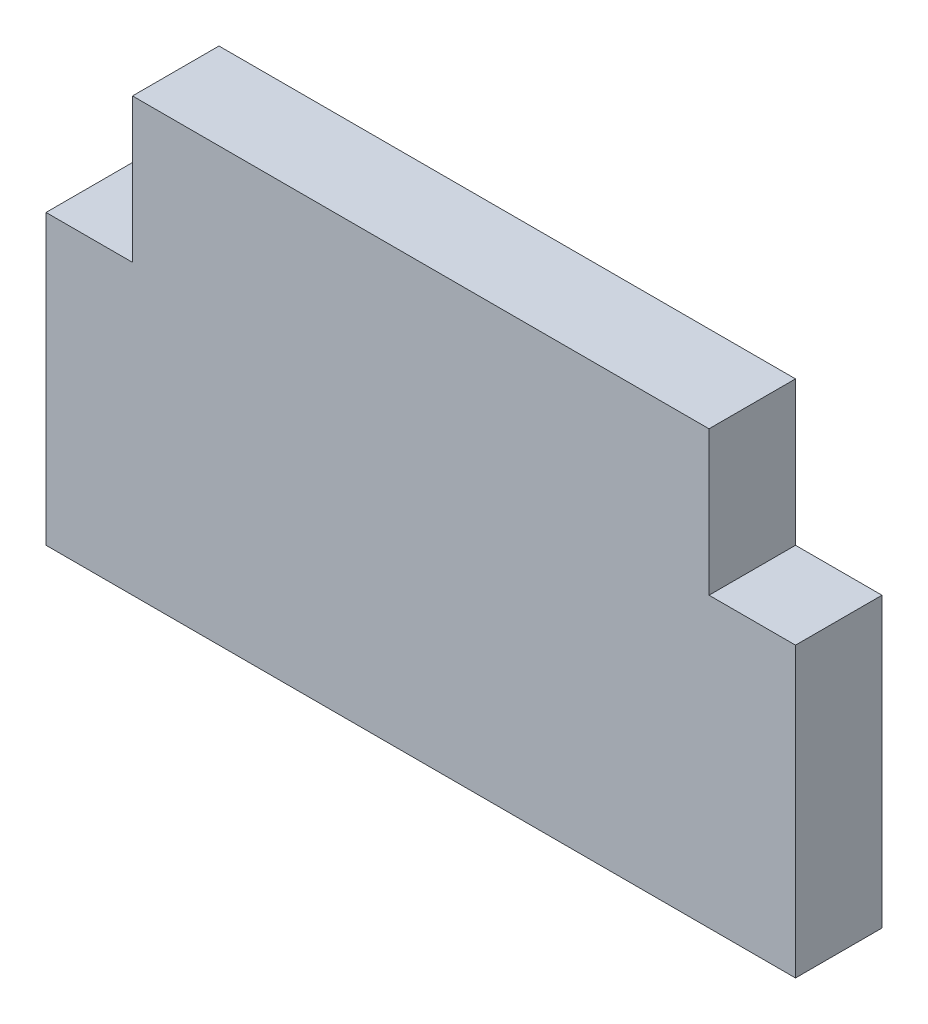
ISO-10303-21;
HEADER;
FILE_DESCRIPTION(('STEP AP214'),'2;1');
FILE_NAME('part.step','',(''),(''),'','','');
FILE_SCHEMA(('AUTOMOTIVE_DESIGN { 1 0 10303 214 1 1 1 1 }'));
ENDSEC;
DATA;
#1=APPLICATION_CONTEXT('core data for automotive mechanical design processes');
#2=APPLICATION_PROTOCOL_DEFINITION('international standard','automotive_design',2000,#1);
#3=PRODUCT_CONTEXT('',#1,'mechanical');
#4=PRODUCT('Part','Part','',(#3));
#5=PRODUCT_RELATED_PRODUCT_CATEGORY('part','',(#4));
#6=PRODUCT_DEFINITION_FORMATION('','',#4);
#7=PRODUCT_DEFINITION_CONTEXT('part definition',#1,'design');
#8=PRODUCT_DEFINITION('design','',#6,#7);
#9=PRODUCT_DEFINITION_SHAPE('','',#8);
#10=(LENGTH_UNIT() NAMED_UNIT(*) SI_UNIT(.MILLI.,.METRE.));
#11=(NAMED_UNIT(*) PLANE_ANGLE_UNIT() SI_UNIT($,.RADIAN.));
#12=(NAMED_UNIT(*) SI_UNIT($,.STERADIAN.) SOLID_ANGLE_UNIT());
#13=UNCERTAINTY_MEASURE_WITH_UNIT(LENGTH_MEASURE(1.E-05),#10,'distance_accuracy_value','');
#14=(GEOMETRIC_REPRESENTATION_CONTEXT(3) GLOBAL_UNCERTAINTY_ASSIGNED_CONTEXT((#13)) GLOBAL_UNIT_ASSIGNED_CONTEXT((#10,
#11,#12)) REPRESENTATION_CONTEXT('',''));
#15=CARTESIAN_POINT('',(0.,0.,0.));
#16=DIRECTION('',(0.,0.,1.));
#17=DIRECTION('',(1.,0.,0.));
#18=AXIS2_PLACEMENT_3D('',#15,#16,#17);
#19=CARTESIAN_POINT('',(10.,0.,3.));
#20=DIRECTION('',(1.,0.,0.));
#21=DIRECTION('',(0.,1.,0.));
#22=AXIS2_PLACEMENT_3D('',#19,#20,#21);
#23=PLANE('',#22);
#24=DIRECTION('',(0.,-1.,0.));
#25=VECTOR('',#24,1.);
#26=CARTESIAN_POINT('',(10.,0.,0.));
#27=LINE('',#26,#25);
#28=CARTESIAN_POINT('',(10.,7.5,0.));
#29=VERTEX_POINT('',#28);
#30=CARTESIAN_POINT('',(10.,2.5,0.));
#31=VERTEX_POINT('',#30);
#32=EDGE_CURVE('E133',#29,#31,#27,.T.);
#33=ORIENTED_EDGE('',*,*,#32,.F.);
#34=DIRECTION('',(0.,0.,-1.));
#35=VECTOR('',#34,1.);
#36=CARTESIAN_POINT('',(10.,7.5,3.));
#37=LINE('',#36,#35);
#38=CARTESIAN_POINT('',(10.,7.5,3.));
#39=VERTEX_POINT('',#38);
#40=EDGE_CURVE('E11',#39,#29,#37,.T.);
#41=ORIENTED_EDGE('',*,*,#40,.F.);
#42=DIRECTION('',(0.,-1.,0.));
#43=VECTOR('',#42,1.);
#44=CARTESIAN_POINT('',(10.,0.,3.));
#45=LINE('',#44,#43);
#46=CARTESIAN_POINT('',(10.,2.5,3.));
#47=VERTEX_POINT('',#46);
#48=EDGE_CURVE('E152',#39,#47,#45,.T.);
#49=ORIENTED_EDGE('',*,*,#48,.T.);
#50=DIRECTION('',(0.,0.,-1.));
#51=VECTOR('',#50,1.);
#52=CARTESIAN_POINT('',(10.,2.5,3.));
#53=LINE('',#52,#51);
#54=EDGE_CURVE('E57',#47,#31,#53,.T.);
#55=ORIENTED_EDGE('',*,*,#54,.T.);
#56=EDGE_LOOP('',(#33,#41,#49,#55));
#57=FACE_BOUND('',#56,.T.);
#58=ADVANCED_FACE('F41',(#57),#23,.T.);
#59=CARTESIAN_POINT('',(0.,7.5,3.));
#60=DIRECTION('',(0.,1.,0.));
#61=DIRECTION('',(-1.,0.,0.));
#62=AXIS2_PLACEMENT_3D('',#59,#60,#61);
#63=PLANE('',#62);
#64=DIRECTION('',(1.,0.,0.));
#65=VECTOR('',#64,1.);
#66=CARTESIAN_POINT('',(0.,7.5,0.));
#67=LINE('',#66,#65);
#68=CARTESIAN_POINT('',(-10.,7.5,0.));
#69=VERTEX_POINT('',#68);
#70=EDGE_CURVE('E135',#69,#29,#67,.T.);
#71=ORIENTED_EDGE('',*,*,#70,.F.);
#72=DIRECTION('',(0.,0.,-1.));
#73=VECTOR('',#72,1.);
#74=CARTESIAN_POINT('',(-10.,7.5,3.));
#75=LINE('',#74,#73);
#76=CARTESIAN_POINT('',(-10.,7.5,3.));
#77=VERTEX_POINT('',#76);
#78=EDGE_CURVE('E49',#77,#69,#75,.T.);
#79=ORIENTED_EDGE('',*,*,#78,.F.);
#80=DIRECTION('',(1.,0.,0.));
#81=VECTOR('',#80,1.);
#82=CARTESIAN_POINT('',(0.,7.5,3.));
#83=LINE('',#82,#81);
#84=EDGE_CURVE('E174',#77,#39,#83,.T.);
#85=ORIENTED_EDGE('',*,*,#84,.T.);
#86=ORIENTED_EDGE('',*,*,#40,.T.);
#87=EDGE_LOOP('',(#71,#79,#85,#86));
#88=FACE_BOUND('',#87,.T.);
#89=ADVANCED_FACE('F173',(#88),#63,.T.);
#90=CARTESIAN_POINT('',(-10.,0.,3.));
#91=DIRECTION('',(1.,0.,0.));
#92=DIRECTION('',(0.,1.,0.));
#93=AXIS2_PLACEMENT_3D('',#90,#91,#92);
#94=PLANE('',#93);
#95=DIRECTION('',(0.,-1.,0.));
#96=VECTOR('',#95,1.);
#97=CARTESIAN_POINT('',(-10.,0.,0.));
#98=LINE('',#97,#96);
#99=CARTESIAN_POINT('',(-10.,2.5,0.));
#100=VERTEX_POINT('',#99);
#101=EDGE_CURVE('E138',#69,#100,#98,.T.);
#102=ORIENTED_EDGE('',*,*,#101,.T.);
#103=DIRECTION('',(0.,0.,-1.));
#104=VECTOR('',#103,1.);
#105=CARTESIAN_POINT('',(-10.,2.5,3.));
#106=LINE('',#105,#104);
#107=CARTESIAN_POINT('',(-10.,2.5,3.));
#108=VERTEX_POINT('',#107);
#109=EDGE_CURVE('E158',#108,#100,#106,.T.);
#110=ORIENTED_EDGE('',*,*,#109,.F.);
#111=DIRECTION('',(0.,-1.,0.));
#112=VECTOR('',#111,1.);
#113=CARTESIAN_POINT('',(-10.,0.,3.));
#114=LINE('',#113,#112);
#115=EDGE_CURVE('E165',#77,#108,#114,.T.);
#116=ORIENTED_EDGE('',*,*,#115,.F.);
#117=ORIENTED_EDGE('',*,*,#78,.T.);
#118=EDGE_LOOP('',(#102,#110,#116,#117));
#119=FACE_BOUND('',#118,.T.);
#120=ADVANCED_FACE('F163',(#119),#94,.F.);
#121=CARTESIAN_POINT('',(0.,2.5,3.));
#122=DIRECTION('',(0.,-1.,0.));
#123=DIRECTION('',(1.,0.,0.));
#124=AXIS2_PLACEMENT_3D('',#121,#122,#123);
#125=PLANE('',#124);
#126=DIRECTION('',(-1.,0.,0.));
#127=VECTOR('',#126,1.);
#128=CARTESIAN_POINT('',(0.,2.5,0.));
#129=LINE('',#128,#127);
#130=CARTESIAN_POINT('',(-13.,2.5,0.));
#131=VERTEX_POINT('',#130);
#132=EDGE_CURVE('E140',#100,#131,#129,.T.);
#133=ORIENTED_EDGE('',*,*,#132,.T.);
#134=DIRECTION('',(0.,0.,-1.));
#135=VECTOR('',#134,1.);
#136=CARTESIAN_POINT('',(-13.,2.5,3.));
#137=LINE('',#136,#135);
#138=CARTESIAN_POINT('',(-13.,2.5,3.));
#139=VERTEX_POINT('',#138);
#140=EDGE_CURVE('E156',#139,#131,#137,.T.);
#141=ORIENTED_EDGE('',*,*,#140,.F.);
#142=DIRECTION('',(-1.,0.,0.));
#143=VECTOR('',#142,1.);
#144=CARTESIAN_POINT('',(0.,2.5,3.));
#145=LINE('',#144,#143);
#146=EDGE_CURVE('E305',#108,#139,#145,.T.);
#147=ORIENTED_EDGE('',*,*,#146,.F.);
#148=ORIENTED_EDGE('',*,*,#109,.T.);
#149=EDGE_LOOP('',(#133,#141,#147,#148));
#150=FACE_BOUND('',#149,.T.);
#151=ADVANCED_FACE('F192',(#150),#125,.F.);
#152=CARTESIAN_POINT('',(-13.,0.,3.));
#153=DIRECTION('',(-1.,0.,0.));
#154=DIRECTION('',(0.,-1.,0.));
#155=AXIS2_PLACEMENT_3D('',#152,#153,#154);
#156=PLANE('',#155);
#157=DIRECTION('',(0.,1.,0.));
#158=VECTOR('',#157,1.);
#159=CARTESIAN_POINT('',(-13.,0.,0.));
#160=LINE('',#159,#158);
#161=CARTESIAN_POINT('',(-13.,-7.5,0.));
#162=VERTEX_POINT('',#161);
#163=EDGE_CURVE('E143',#162,#131,#160,.T.);
#164=ORIENTED_EDGE('',*,*,#163,.F.);
#165=DIRECTION('',(0.,0.,-1.));
#166=VECTOR('',#165,1.);
#167=CARTESIAN_POINT('',(-13.,-7.5,3.));
#168=LINE('',#167,#166);
#169=CARTESIAN_POINT('',(-13.,-7.5,3.));
#170=VERTEX_POINT('',#169);
#171=EDGE_CURVE('E125',#170,#162,#168,.T.);
#172=ORIENTED_EDGE('',*,*,#171,.F.);
#173=DIRECTION('',(0.,1.,0.));
#174=VECTOR('',#173,1.);
#175=CARTESIAN_POINT('',(-13.,0.,3.));
#176=LINE('',#175,#174);
#177=EDGE_CURVE('E115',#170,#139,#176,.T.);
#178=ORIENTED_EDGE('',*,*,#177,.T.);
#179=ORIENTED_EDGE('',*,*,#140,.T.);
#180=EDGE_LOOP('',(#164,#172,#178,#179));
#181=FACE_BOUND('',#180,.T.);
#182=ADVANCED_FACE('F197',(#181),#156,.T.);
#183=CARTESIAN_POINT('',(0.,-7.5,3.));
#184=DIRECTION('',(0.,1.,0.));
#185=DIRECTION('',(-1.,0.,0.));
#186=AXIS2_PLACEMENT_3D('',#183,#184,#185);
#187=PLANE('',#186);
#188=DIRECTION('',(1.,0.,0.));
#189=VECTOR('',#188,1.);
#190=CARTESIAN_POINT('',(0.,-7.5,0.));
#191=LINE('',#190,#189);
#192=CARTESIAN_POINT('',(13.,-7.5,0.));
#193=VERTEX_POINT('',#192);
#194=EDGE_CURVE('E122',#162,#193,#191,.T.);
#195=ORIENTED_EDGE('',*,*,#194,.T.);
#196=DIRECTION('',(0.,0.,-1.));
#197=VECTOR('',#196,1.);
#198=CARTESIAN_POINT('',(13.,-7.5,3.));
#199=LINE('',#198,#197);
#200=CARTESIAN_POINT('',(13.,-7.5,3.));
#201=VERTEX_POINT('',#200);
#202=EDGE_CURVE('E119',#201,#193,#199,.T.);
#203=ORIENTED_EDGE('',*,*,#202,.F.);
#204=DIRECTION('',(1.,0.,0.));
#205=VECTOR('',#204,1.);
#206=CARTESIAN_POINT('',(0.,-7.5,3.));
#207=LINE('',#206,#205);
#208=EDGE_CURVE('E108',#170,#201,#207,.T.);
#209=ORIENTED_EDGE('',*,*,#208,.F.);
#210=ORIENTED_EDGE('',*,*,#171,.T.);
#211=EDGE_LOOP('',(#195,#203,#209,#210));
#212=FACE_BOUND('',#211,.T.);
#213=ADVANCED_FACE('F120',(#212),#187,.F.);
#214=CARTESIAN_POINT('',(13.,0.,3.));
#215=DIRECTION('',(-1.,0.,0.));
#216=DIRECTION('',(0.,0.,1.));
#217=AXIS2_PLACEMENT_3D('',#214,#215,#216);
#218=PLANE('',#217);
#219=DIRECTION('',(0.,1.,0.));
#220=VECTOR('',#219,1.);
#221=CARTESIAN_POINT('',(13.,0.,0.));
#222=LINE('',#221,#220);
#223=CARTESIAN_POINT('',(13.,2.5,0.));
#224=VERTEX_POINT('',#223);
#225=EDGE_CURVE('E147',#193,#224,#222,.T.);
#226=ORIENTED_EDGE('',*,*,#225,.T.);
#227=DIRECTION('',(0.,0.,-1.));
#228=VECTOR('',#227,1.);
#229=CARTESIAN_POINT('',(13.,2.5,3.));
#230=LINE('',#229,#228);
#231=CARTESIAN_POINT('',(13.,2.5,3.));
#232=VERTEX_POINT('',#231);
#233=EDGE_CURVE('E83',#232,#224,#230,.T.);
#234=ORIENTED_EDGE('',*,*,#233,.F.);
#235=DIRECTION('',(0.,1.,0.));
#236=VECTOR('',#235,1.);
#237=CARTESIAN_POINT('',(13.,0.,3.));
#238=LINE('',#237,#236);
#239=EDGE_CURVE('E113',#201,#232,#238,.T.);
#240=ORIENTED_EDGE('',*,*,#239,.F.);
#241=ORIENTED_EDGE('',*,*,#202,.T.);
#242=EDGE_LOOP('',(#226,#234,#240,#241));
#243=FACE_BOUND('',#242,.T.);
#244=ADVANCED_FACE('F127',(#243),#218,.F.);
#245=CARTESIAN_POINT('',(0.,2.5,3.));
#246=DIRECTION('',(0.,1.,0.));
#247=DIRECTION('',(0.,0.,1.));
#248=AXIS2_PLACEMENT_3D('',#245,#246,#247);
#249=PLANE('',#248);
#250=DIRECTION('',(1.,0.,0.));
#251=VECTOR('',#250,1.);
#252=CARTESIAN_POINT('',(0.,2.5,0.));
#253=LINE('',#252,#251);
#254=EDGE_CURVE('E149',#31,#224,#253,.T.);
#255=ORIENTED_EDGE('',*,*,#254,.F.);
#256=ORIENTED_EDGE('',*,*,#54,.F.);
#257=DIRECTION('',(1.,0.,0.));
#258=VECTOR('',#257,1.);
#259=CARTESIAN_POINT('',(0.,2.5,3.));
#260=LINE('',#259,#258);
#261=EDGE_CURVE('E128',#47,#232,#260,.T.);
#262=ORIENTED_EDGE('',*,*,#261,.T.);
#263=ORIENTED_EDGE('',*,*,#233,.T.);
#264=EDGE_LOOP('',(#255,#256,#262,#263));
#265=FACE_BOUND('',#264,.T.);
#266=ADVANCED_FACE('F175',(#265),#249,.T.);
#267=CARTESIAN_POINT('',(0.,0.,3.));
#268=DIRECTION('',(0.,0.,1.));
#269=DIRECTION('',(1.,0.,0.));
#270=AXIS2_PLACEMENT_3D('',#267,#268,#269);
#271=PLANE('',#270);
#272=ORIENTED_EDGE('',*,*,#48,.F.);
#273=ORIENTED_EDGE('',*,*,#84,.F.);
#274=ORIENTED_EDGE('',*,*,#115,.T.);
#275=ORIENTED_EDGE('',*,*,#146,.T.);
#276=ORIENTED_EDGE('',*,*,#177,.F.);
#277=ORIENTED_EDGE('',*,*,#208,.T.);
#278=ORIENTED_EDGE('',*,*,#239,.T.);
#279=ORIENTED_EDGE('',*,*,#261,.F.);
#280=EDGE_LOOP('',(#272,#273,#274,#275,#276,#277,#278,#279));
#281=FACE_BOUND('',#280,.T.);
#282=ADVANCED_FACE('F110',(#281),#271,.T.);
#283=CARTESIAN_POINT('',(0.,0.,0.));
#284=DIRECTION('',(0.,0.,1.));
#285=DIRECTION('',(1.,0.,0.));
#286=AXIS2_PLACEMENT_3D('',#283,#284,#285);
#287=PLANE('',#286);
#288=ORIENTED_EDGE('',*,*,#32,.T.);
#289=ORIENTED_EDGE('',*,*,#254,.T.);
#290=ORIENTED_EDGE('',*,*,#225,.F.);
#291=ORIENTED_EDGE('',*,*,#194,.F.);
#292=ORIENTED_EDGE('',*,*,#163,.T.);
#293=ORIENTED_EDGE('',*,*,#132,.F.);
#294=ORIENTED_EDGE('',*,*,#101,.F.);
#295=ORIENTED_EDGE('',*,*,#70,.T.);
#296=EDGE_LOOP('',(#288,#289,#290,#291,#292,#293,#294,#295));
#297=FACE_BOUND('',#296,.T.);
#298=ADVANCED_FACE('F172',(#297),#287,.F.);
#299=CLOSED_SHELL('',(#58,#89,#120,#151,#182,#213,#244,#266,#282,#298));
#300=MANIFOLD_SOLID_BREP('B2',#299);
#301=ADVANCED_BREP_SHAPE_REPRESENTATION('',(#18,#300),#14);
#302=SHAPE_DEFINITION_REPRESENTATION(#9,#301);
ENDSEC;
END-ISO-10303-21;
